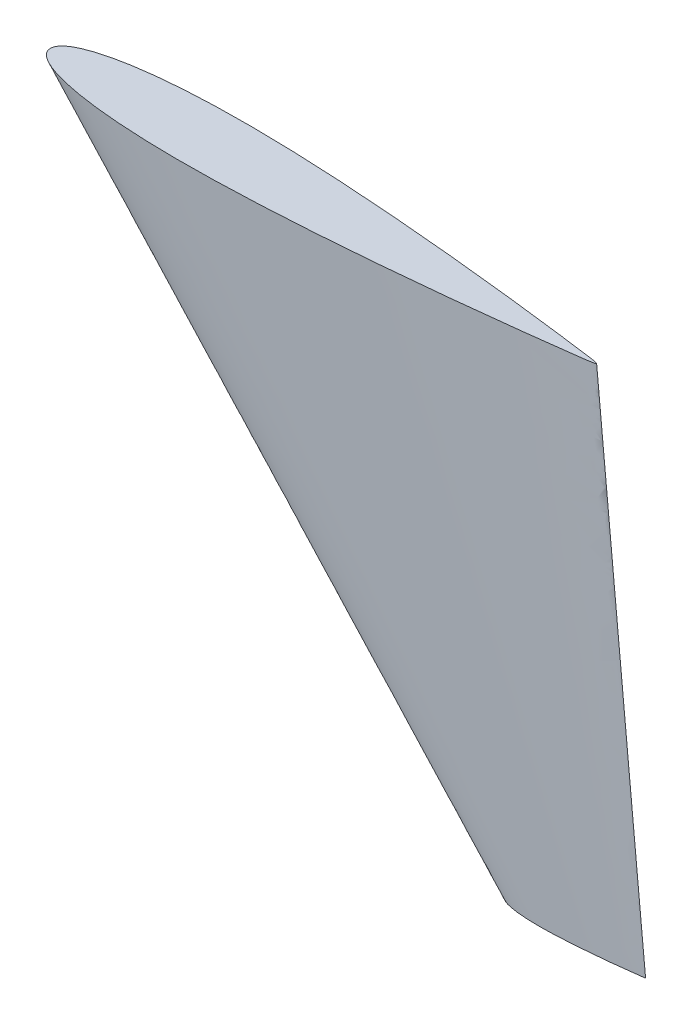
ISO-10303-21;
HEADER;
FILE_DESCRIPTION(('STEP AP214'),'2;1');
FILE_NAME('part.step','',(''),(''),'','','');
FILE_SCHEMA(('AUTOMOTIVE_DESIGN { 1 0 10303 214 1 1 1 1 }'));
ENDSEC;
DATA;
#1=APPLICATION_CONTEXT('core data for automotive mechanical design processes');
#2=APPLICATION_PROTOCOL_DEFINITION('international standard','automotive_design',2000,#1);
#3=PRODUCT_CONTEXT('',#1,'mechanical');
#4=PRODUCT('Part','Part','',(#3));
#5=PRODUCT_RELATED_PRODUCT_CATEGORY('part','',(#4));
#6=PRODUCT_DEFINITION_FORMATION('','',#4);
#7=PRODUCT_DEFINITION_CONTEXT('part definition',#1,'design');
#8=PRODUCT_DEFINITION('design','',#6,#7);
#9=PRODUCT_DEFINITION_SHAPE('','',#8);
#10=(LENGTH_UNIT() NAMED_UNIT(*) SI_UNIT(.MILLI.,.METRE.));
#11=(NAMED_UNIT(*) PLANE_ANGLE_UNIT() SI_UNIT($,.RADIAN.));
#12=(NAMED_UNIT(*) SI_UNIT($,.STERADIAN.) SOLID_ANGLE_UNIT());
#13=UNCERTAINTY_MEASURE_WITH_UNIT(LENGTH_MEASURE(1.E-05),#10,'distance_accuracy_value','');
#14=(GEOMETRIC_REPRESENTATION_CONTEXT(3) GLOBAL_UNCERTAINTY_ASSIGNED_CONTEXT((#13)) GLOBAL_UNIT_ASSIGNED_CONTEXT((#10,
#11,#12)) REPRESENTATION_CONTEXT('',''));
#15=CARTESIAN_POINT('',(0.,0.,0.));
#16=DIRECTION('',(0.,0.,1.));
#17=DIRECTION('',(1.,0.,0.));
#18=AXIS2_PLACEMENT_3D('',#15,#16,#17);
#19=CARTESIAN_POINT('',(0.,0.,-2.89213779437517E-12));
#20=DIRECTION('',(0.,-1.,0.));
#21=DIRECTION('',(0.,0.,-1.));
#22=AXIS2_PLACEMENT_3D('',#19,#20,#21);
#23=PLANE('',#22);
#24=CARTESIAN_POINT('',(7800.,0.,0.));
#25=CARTESIAN_POINT('',(7800.,0.,-6.53925924655097));
#26=CARTESIAN_POINT('',(7715.67329600913,0.,-24.3669523544777));
#27=CARTESIAN_POINT('',(7640.06647862999,0.,-30.8897909751289));
#28=CARTESIAN_POINT('',(7506.69214567683,0.,-50.5762287041684));
#29=CARTESIAN_POINT('',(7362.75356535692,0.,-69.0228106852286));
#30=CARTESIAN_POINT('',(7198.72313680974,0.,-90.5200279945573));
#31=CARTESIAN_POINT('',(7022.25196467298,0.,-112.692921099859));
#32=CARTESIAN_POINT('',(6834.27758249127,0.,-135.808011807423));
#33=CARTESIAN_POINT('',(6637.06943651528,0.,-159.394110654187));
#34=CARTESIAN_POINT('',(6432.07399162929,0.,-183.099280039837));
#35=CARTESIAN_POINT('',(6220.65040230479,0.,-206.882728292744));
#36=CARTESIAN_POINT('',(6003.93279029509,0.,-230.360435754586));
#37=CARTESIAN_POINT('',(5782.96571679836,0.,-253.604866134166));
#38=CARTESIAN_POINT('',(5558.69013182153,0.,-276.274064255674));
#39=CARTESIAN_POINT('',(5331.96829520196,0.,-298.245530819103));
#40=CARTESIAN_POINT('',(5103.60656338106,0.,-319.413756594173));
#41=CARTESIAN_POINT('',(4874.3511666855,0.,-339.839380895817));
#42=CARTESIAN_POINT('',(4644.83670892462,0.,-358.937100799179));
#43=CARTESIAN_POINT('',(4415.73297948451,0.,-377.096461196962));
#44=CARTESIAN_POINT('',(4187.62692680943,0.,-393.801210238087));
#45=CARTESIAN_POINT('',(3961.12393046965,0.,-409.332226476269));
#46=CARTESIAN_POINT('',(3736.73644679765,0.,-423.100620615322));
#47=CARTESIAN_POINT('',(3515.00574819094,0.,-435.28472535015));
#48=CARTESIAN_POINT('',(3296.42152697293,0.,-445.762492618663));
#49=CARTESIAN_POINT('',(3081.44991889856,0.,-454.397354141702));
#50=CARTESIAN_POINT('',(2870.55390258635,0.,-460.905755312769));
#51=CARTESIAN_POINT('',(2664.18654016437,0.,-465.616457962664));
#52=CARTESIAN_POINT('',(2462.75311754355,0.,-467.99250286914));
#53=CARTESIAN_POINT('',(2266.67474484628,0.,-468.430992739171));
#54=CARTESIAN_POINT('',(2076.3414608842,0.,-466.36091762238));
#55=CARTESIAN_POINT('',(1892.13829254239,0.,-462.260282902571));
#56=CARTESIAN_POINT('',(1714.43584887484,0.,-455.727917427635));
#57=CARTESIAN_POINT('',(1543.59300624981,0.,-446.976237187352));
#58=CARTESIAN_POINT('',(1379.99762905575,0.,-435.984639569769));
#59=CARTESIAN_POINT('',(1223.97029033573,0.,-422.688570015667));
#60=CARTESIAN_POINT('',(1075.82583002026,0.,-407.301819553241));
#61=CARTESIAN_POINT('',(935.912616229804,0.,-389.566943881137));
#62=CARTESIAN_POINT('',(804.536382757159,0.,-369.854970921905));
#63=CARTESIAN_POINT('',(682.013792436799,0.,-348.272555877616));
#64=CARTESIAN_POINT('',(568.693027246663,0.,-324.568119904927));
#65=CARTESIAN_POINT('',(464.786855228411,0.,-299.165291646043));
#66=CARTESIAN_POINT('',(370.596753034188,0.,-272.055292928938));
#67=CARTESIAN_POINT('',(286.404046182979,0.,-243.356904752415));
#68=CARTESIAN_POINT('',(212.506820599986,0.,-213.083136367971));
#69=CARTESIAN_POINT('',(149.052021217133,0.,-181.459345845315));
#70=CARTESIAN_POINT('',(96.2757843861637,0.,-148.410904473162));
#71=CARTESIAN_POINT('',(54.3577326462225,0.,-113.918531986578));
#72=CARTESIAN_POINT('',(23.5554280154315,0.,-77.7813546525763));
#73=CARTESIAN_POINT('',(4.41874234212622,0.,-39.661970030682));
#74=CARTESIAN_POINT('',(-2.1412179041184,0.,4.93934917453882E-13));
#75=CARTESIAN_POINT('',(4.41874234212666,0.,39.661970030684));
#76=CARTESIAN_POINT('',(23.5554280154311,0.,77.7813546525725));
#77=CARTESIAN_POINT('',(54.3577326462229,0.,113.91853198658));
#78=CARTESIAN_POINT('',(96.2757843861631,0.,148.410904473159));
#79=CARTESIAN_POINT('',(149.052021217134,0.,181.459345845317));
#80=CARTESIAN_POINT('',(212.506820599985,0.,213.083136367972));
#81=CARTESIAN_POINT('',(286.404046182979,0.,243.356904752415));
#82=CARTESIAN_POINT('',(370.596753034187,0.,272.055292928939));
#83=CARTESIAN_POINT('',(464.786855228411,0.,299.165291646041));
#84=CARTESIAN_POINT('',(568.693027246663,0.,324.568119904926));
#85=CARTESIAN_POINT('',(682.013792436799,0.,348.272555877616));
#86=CARTESIAN_POINT('',(804.536382757158,0.,369.854970921905));
#87=CARTESIAN_POINT('',(935.912616229805,0.,389.566943881137));
#88=CARTESIAN_POINT('',(1075.82583002026,0.,407.30181955324));
#89=CARTESIAN_POINT('',(1223.97029033572,0.,422.688570015665));
#90=CARTESIAN_POINT('',(1379.99762905575,0.,435.984639569768));
#91=CARTESIAN_POINT('',(1543.59300624981,0.,446.976237187353));
#92=CARTESIAN_POINT('',(1714.43584887483,0.,455.727917427633));
#93=CARTESIAN_POINT('',(1892.1382925424,0.,462.260282902571));
#94=CARTESIAN_POINT('',(2076.3414608842,0.,466.36091762238));
#95=CARTESIAN_POINT('',(2266.67474484627,0.,468.430992739172));
#96=CARTESIAN_POINT('',(2462.75311754355,0.,467.992502869139));
#97=CARTESIAN_POINT('',(2664.18654016436,0.,465.616457962664));
#98=CARTESIAN_POINT('',(2870.55390258635,0.,460.90575531277));
#99=CARTESIAN_POINT('',(3081.44991889855,0.,454.397354141699));
#100=CARTESIAN_POINT('',(3296.42152697293,0.,445.762492618662));
#101=CARTESIAN_POINT('',(3515.00574819094,0.,435.284725350148));
#102=CARTESIAN_POINT('',(3736.73644679765,0.,423.100620615321));
#103=CARTESIAN_POINT('',(3961.12393046965,0.,409.332226476268));
#104=CARTESIAN_POINT('',(4187.62692680943,0.,393.801210238087));
#105=CARTESIAN_POINT('',(4415.73297948451,0.,377.096461196962));
#106=CARTESIAN_POINT('',(4644.83670892462,0.,358.937100799178));
#107=CARTESIAN_POINT('',(4874.3511666855,0.,339.839380895817));
#108=CARTESIAN_POINT('',(5103.60656338106,0.,319.413756594172));
#109=CARTESIAN_POINT('',(5331.96829520197,0.,298.245530819101));
#110=CARTESIAN_POINT('',(5558.69013182153,0.,276.274064255672));
#111=CARTESIAN_POINT('',(5782.96571679836,0.,253.604866134166));
#112=CARTESIAN_POINT('',(6003.93279029508,0.,230.360435754585));
#113=CARTESIAN_POINT('',(6220.6504023048,0.,206.882728292743));
#114=CARTESIAN_POINT('',(6432.07399162929,0.,183.099280039837));
#115=CARTESIAN_POINT('',(6637.06943651528,0.,159.394110654187));
#116=CARTESIAN_POINT('',(6834.27758249126,0.,135.808011807422));
#117=CARTESIAN_POINT('',(7022.25196467298,0.,112.692921099855));
#118=CARTESIAN_POINT('',(7198.72313680974,0.,90.5200279945546));
#119=CARTESIAN_POINT('',(7362.75356535692,0.,69.0228106852282));
#120=CARTESIAN_POINT('',(7506.69214567683,0.,50.5762287041657));
#121=CARTESIAN_POINT('',(7640.06647862999,0.,30.8897909751275));
#122=CARTESIAN_POINT('',(7715.67329600913,0.,24.3669523544768));
#123=CARTESIAN_POINT('',(7800.,0.,6.53925924655098));
#124=CARTESIAN_POINT('',(7800.,0.,0.));
#125=B_SPLINE_CURVE_WITH_KNOTS('',3,(#24,#25,#26,#27,#28,#29,#30,#31,#32,#33,#34,#35,#36,#37,
#38,#39,#40,#41,#42,#43,#44,#45,#46,#47,#48,#49,#50,#51,#52,#53,#54,#55,#56,#57,#58,#59,#60,#61,
#62,#63,#64,#65,#66,#67,#68,#69,#70,#71,#72,#73,#74,#75,#76,#77,#78,#79,#80,#81,#82,#83,#84,#85,
#86,#87,#88,#89,#90,#91,#92,#93,#94,#95,#96,#97,#98,#99,#100,#101,#102,#103,#104,#105,#106,#107,
#108,#109,#110,#111,#112,#113,#114,#115,#116,#117,#118,#119,#120,#121,#122,#123,#124),
.UNSPECIFIED.,.T.,.F.,(4,1,1,1,1,1,1,1,1,1,1,1,1,1,1,1,1,1,1,1,1,1,1,1,1,1,1,1,1,1,1,1,1,1,1,1,
1,1,1,1,1,1,1,1,1,1,1,1,1,1,1,1,1,1,1,1,1,1,1,1,1,1,1,1,1,1,1,1,1,1,1,1,1,1,1,1,1,1,1,1,1,1,1,1,
1,1,1,1,1,1,1,1,1,1,1,1,1,1,4),(0.,0.00370123987506932,0.0100905264837692,0.0181897398349947,
0.0275712531032488,0.0379779032348915,0.0492199890854108,0.0611589846164829,0.0736758380002269,
0.0866758818301919,0.100070487809901,0.113794850526326,0.127780381717722,0.141967224326997,
0.156300965539977,0.170732574325841,0.185213017834877,0.199701805107877,0.214160602617209,
0.228549517539899,0.242829846374342,0.256971419856509,0.270940603732409,0.284703511960829,
0.298235956775089,0.311509100343719,0.324489816433092,0.337159349651097,0.349494602042227,
0.361462813894123,0.373050959586776,0.384236738836534,0.394992869371616,0.405307195090872,
0.415153289482299,0.424519405818651,0.433390491805171,0.441744901957357,0.449567589605019,
0.456846488766345,0.463571987722499,0.469733338138845,0.47532270467788,0.480336691423548,
0.484781058090828,0.488676263152727,0.492054747684636,0.494979990042027,0.497567422047131,0.5,
0.502432577952869,0.505020009957974,0.507945252315365,0.511323736847273,0.515218941909172,
0.519663308576452,0.524677295322121,0.530266661861155,0.536428012277502,0.543153511233656,
0.550432410394982,0.558255098042644,0.566609508194829,0.575480594181349,0.584846710517701,
0.594692804909128,0.605007130628384,0.615763261163466,0.626949040413224,0.638537186105877,
0.650505397957773,0.662840650348903,0.675510183566908,0.688490899656281,0.701764043224911,
0.715296488039171,0.729059396267592,0.743028580143492,0.757170153625658,0.771450482460101,
0.785839397382791,0.800298194892123,0.814786982165123,0.82926742567416,0.843699034460024,
0.858032775673003,0.872219618282278,0.886205149473674,0.899929512190099,0.913324118169808,
0.926324161999773,0.938841015383517,0.950780010914589,0.962022096765109,0.972428746896751,
0.981810260165005,0.989909473516231,0.996298760124931,1.),.UNSPECIFIED.);
#126=CARTESIAN_POINT('',(7800.,0.,0.));
#127=VERTEX_POINT('',#126);
#128=EDGE_CURVE('E11',#127,#127,#125,.T.);
#129=ORIENTED_EDGE('',*,*,#128,.T.);
#130=EDGE_LOOP('',(#129));
#131=FACE_BOUND('',#130,.T.);
#132=ADVANCED_FACE('F51',(#131),#23,.F.);
#133=CARTESIAN_POINT('',(6500.,-7250.,-6.37019547186018E-12));
#134=DIRECTION('',(0.,-1.,0.));
#135=DIRECTION('',(0.,0.,-1.));
#136=AXIS2_PLACEMENT_3D('',#133,#134,#135);
#137=PLANE('',#136);
#138=CARTESIAN_POINT('',(8500.,-7250.,0.));
#139=CARTESIAN_POINT('',(8500.,-7250.,-1.67673314014127));
#140=CARTESIAN_POINT('',(8478.37776820747,-7250.,-6.24793650114817));
#141=CARTESIAN_POINT('',(8458.99140477692,-7250.,-7.92045922439215));
#142=CARTESIAN_POINT('',(8424.79285786585,-7250.,-12.9682637702997));
#143=CARTESIAN_POINT('',(8387.8855295787,-7250.,-17.6981565859566));
#144=CARTESIAN_POINT('',(8345.82644533583,-7250.,-23.2102635883487));
#145=CARTESIAN_POINT('',(8300.57742683923,-7250.,-28.8956207948364));
#146=CARTESIAN_POINT('',(8252.37886730546,-7250.,-34.8225671301093));
#147=CARTESIAN_POINT('',(8201.81267602956,-7250.,-40.8702847831261));
#148=CARTESIAN_POINT('',(8149.24974144341,-7250.,-46.948533343549));
#149=CARTESIAN_POINT('',(8095.03856469354,-7250.,-53.0468534083973));
#150=CARTESIAN_POINT('',(8039.46994622951,-7250.,-59.0667783986132));
#151=CARTESIAN_POINT('',(7982.81172225599,-7250.,-65.0268887523517));
#152=CARTESIAN_POINT('',(7925.30516200552,-7250.,-70.8395036553026));
#153=CARTESIAN_POINT('',(7867.1713577441,-7250.,-76.4732130305411));
#154=CARTESIAN_POINT('',(7808.6170675336,-7250.,-81.9009632292776));
#155=CARTESIAN_POINT('',(7749.83363248346,-7250.,-87.1383027938011));
#156=CARTESIAN_POINT('',(7690.98377151914,-7250.,-92.0351540510742));
#157=CARTESIAN_POINT('',(7632.23922550886,-7250.,-96.691400306916));
#158=CARTESIAN_POINT('',(7573.7504940537,-7250.,-100.97466929182));
#159=CARTESIAN_POINT('',(7515.67280268453,-7250.,-104.956981147765));
#160=CARTESIAN_POINT('',(7458.13755046093,-7250.,-108.487338619317));
#161=CARTESIAN_POINT('',(7401.28352517716,-7250.,-111.611468038503));
#162=CARTESIAN_POINT('',(7345.23628896742,-7250.,-114.29807503043));
#163=CARTESIAN_POINT('',(7290.11536382014,-7250.,-116.512142087619));
#164=CARTESIAN_POINT('',(7236.03946220163,-7250.,-118.180962900714));
#165=CARTESIAN_POINT('',(7183.1247538883,-7250.,-119.388835375046));
#166=CARTESIAN_POINT('',(7131.4751583445,-7250.,-119.998077658758));
#167=CARTESIAN_POINT('',(7081.1986525247,-7250.,-120.110510958766));
#168=CARTESIAN_POINT('',(7032.39524638057,-7250.,-119.579722467281));
#169=CARTESIAN_POINT('',(6985.16366475446,-7250.,-118.52827766733));
#170=CARTESIAN_POINT('',(6939.59893560893,-7250.,-116.853312160937));
#171=CARTESIAN_POINT('',(6895.79307852559,-7250.,-114.609291586505));
#172=CARTESIAN_POINT('',(6853.84554591173,-7250.,-111.790933223023));
#173=CARTESIAN_POINT('',(6813.83853598352,-7250.,-108.381684619407));
#174=CARTESIAN_POINT('',(6775.85277692827,-7250.,-104.436363988016));
#175=CARTESIAN_POINT('',(6739.97759390508,-7250.,-99.8889599695276));
#176=CARTESIAN_POINT('',(6706.29138019414,-7250.,-94.8346079286989));
#177=CARTESIAN_POINT('',(6674.87533139405,-7250.,-89.3006553532399));
#178=CARTESIAN_POINT('',(6645.81872493504,-7250.,-83.2225948474223));
#179=CARTESIAN_POINT('',(6619.17611672523,-7250.,-76.7090491400159));
#180=CARTESIAN_POINT('',(6595.02480847031,-7250.,-69.7577674176821));
#181=CARTESIAN_POINT('',(6573.43693491871,-7250.,-62.3992063467786));
#182=CARTESIAN_POINT('',(6554.48892835897,-7250.,-54.6367016328187));
#183=CARTESIAN_POINT('',(6538.21846697875,-7250.,-46.5280373962402));
#184=CARTESIAN_POINT('',(6524.68609856056,-7250.,-38.0540780700472));
#185=CARTESIAN_POINT('',(6513.9378801657,-7250.,-29.209879996564));
#186=CARTESIAN_POINT('',(6506.03985333729,-7250.,-19.9439370904096));
#187=CARTESIAN_POINT('',(6501.13301085696,-7250.,-10.1697359053089));
#188=CARTESIAN_POINT('',(6499.45096976818,-7250.,-5.45203157884016E-12));
#189=CARTESIAN_POINT('',(6501.13301085695,-7250.,10.1697359052979));
#190=CARTESIAN_POINT('',(6506.03985333729,-7250.,19.9439370903977));
#191=CARTESIAN_POINT('',(6513.9378801657,-7250.,29.2098799965535));
#192=CARTESIAN_POINT('',(6524.68609856056,-7250.,38.0540780700355));
#193=CARTESIAN_POINT('',(6538.21846697875,-7250.,46.5280373962296));
#194=CARTESIAN_POINT('',(6554.48892835897,-7250.,54.6367016328081));
#195=CARTESIAN_POINT('',(6573.43693491871,-7250.,62.3992063467678));
#196=CARTESIAN_POINT('',(6595.02480847031,-7250.,69.7577674176715));
#197=CARTESIAN_POINT('',(6619.17611672523,-7250.,76.7090491400055));
#198=CARTESIAN_POINT('',(6645.81872493504,-7250.,83.2225948474117));
#199=CARTESIAN_POINT('',(6674.87533139405,-7250.,89.3006553532299));
#200=CARTESIAN_POINT('',(6706.29138019414,-7250.,94.8346079286887));
#201=CARTESIAN_POINT('',(6739.97759390508,-7250.,99.8889599695175));
#202=CARTESIAN_POINT('',(6775.85277692827,-7250.,104.436363988006));
#203=CARTESIAN_POINT('',(6813.83853598352,-7250.,108.381684619397));
#204=CARTESIAN_POINT('',(6853.84554591173,-7250.,111.790933223013));
#205=CARTESIAN_POINT('',(6895.79307852559,-7250.,114.609291586496));
#206=CARTESIAN_POINT('',(6939.59893560893,-7250.,116.853312160928));
#207=CARTESIAN_POINT('',(6985.16366475446,-7250.,118.528277667322));
#208=CARTESIAN_POINT('',(7032.39524638057,-7250.,119.579722467273));
#209=CARTESIAN_POINT('',(7081.19865252469,-7250.,120.110510958758));
#210=CARTESIAN_POINT('',(7131.4751583445,-7250.,119.99807765875));
#211=CARTESIAN_POINT('',(7183.1247538883,-7250.,119.388835375039));
#212=CARTESIAN_POINT('',(7236.03946220163,-7250.,118.180962900707));
#213=CARTESIAN_POINT('',(7290.11536382014,-7250.,116.512142087612));
#214=CARTESIAN_POINT('',(7345.23628896742,-7250.,114.298075030423));
#215=CARTESIAN_POINT('',(7401.28352517717,-7250.,111.611468038497));
#216=CARTESIAN_POINT('',(7458.13755046094,-7250.,108.48733861931));
#217=CARTESIAN_POINT('',(7515.67280268453,-7250.,104.956981147758));
#218=CARTESIAN_POINT('',(7573.7504940537,-7250.,100.974669291815));
#219=CARTESIAN_POINT('',(7632.23922550885,-7250.,96.6914003069109));
#220=CARTESIAN_POINT('',(7690.98377151914,-7250.,92.0351540510691));
#221=CARTESIAN_POINT('',(7749.83363248346,-7250.,87.1383027937972));
#222=CARTESIAN_POINT('',(7808.61706753361,-7250.,81.9009632292731));
#223=CARTESIAN_POINT('',(7867.17135774409,-7250.,76.4732130305372));
#224=CARTESIAN_POINT('',(7925.30516200551,-7250.,70.8395036552992));
#225=CARTESIAN_POINT('',(7982.81172225599,-7250.,65.0268887523488));
#226=CARTESIAN_POINT('',(8039.46994622951,-7250.,59.0667783986104));
#227=CARTESIAN_POINT('',(8095.03856469354,-7250.,53.0468534083944));
#228=CARTESIAN_POINT('',(8149.24974144342,-7250.,46.9485333435471));
#229=CARTESIAN_POINT('',(8201.81267602956,-7250.,40.870284783124));
#230=CARTESIAN_POINT('',(8252.37886730546,-7250.,34.8225671301077));
#231=CARTESIAN_POINT('',(8300.57742683923,-7250.,28.8956207948341));
#232=CARTESIAN_POINT('',(8345.82644533583,-7250.,23.2102635883469));
#233=CARTESIAN_POINT('',(8387.8855295787,-7250.,17.6981565859555));
#234=CARTESIAN_POINT('',(8424.79285786586,-7250.,12.9682637702986));
#235=CARTESIAN_POINT('',(8458.99140477692,-7250.,7.9204592243915));
#236=CARTESIAN_POINT('',(8478.37776820747,-7250.,6.24793650114773));
#237=CARTESIAN_POINT('',(8500.,-7250.,1.67673314014125));
#238=CARTESIAN_POINT('',(8500.,-7250.,0.));
#239=B_SPLINE_CURVE_WITH_KNOTS('',3,(#138,#139,#140,#141,#142,#143,#144,#145,#146,#147,#148,
#149,#150,#151,#152,#153,#154,#155,#156,#157,#158,#159,#160,#161,#162,#163,#164,#165,#166,#167,
#168,#169,#170,#171,#172,#173,#174,#175,#176,#177,#178,#179,#180,#181,#182,#183,#184,#185,#186,
#187,#188,#189,#190,#191,#192,#193,#194,#195,#196,#197,#198,#199,#200,#201,#202,#203,#204,#205,
#206,#207,#208,#209,#210,#211,#212,#213,#214,#215,#216,#217,#218,#219,#220,#221,#222,#223,#224,
#225,#226,#227,#228,#229,#230,#231,#232,#233,#234,#235,#236,#237,#238),.UNSPECIFIED.,.T.,.F.,(4,
1,1,1,1,1,1,1,1,1,1,1,1,1,1,1,1,1,1,1,1,1,1,1,1,1,1,1,1,1,1,1,1,1,1,1,1,1,1,1,1,1,1,1,1,1,1,1,1,
1,1,1,1,1,1,1,1,1,1,1,1,1,1,1,1,1,1,1,1,1,1,1,1,1,1,1,1,1,1,1,1,1,1,1,1,1,1,1,1,1,1,1,1,1,1,1,1,
1,4),(0.,0.00370123987506932,0.0100905264837692,0.0181897398349947,0.0275712531032488,
0.0379779032348915,0.0492199890854108,0.0611589846164829,0.0736758380002269,0.0866758818301919,
0.100070487809901,0.113794850526326,0.127780381717722,0.141967224326997,0.156300965539977,
0.170732574325841,0.185213017834877,0.199701805107877,0.214160602617209,0.228549517539899,
0.242829846374342,0.256971419856509,0.270940603732409,0.284703511960829,0.298235956775089,
0.311509100343719,0.324489816433092,0.337159349651097,0.349494602042227,0.361462813894123,
0.373050959586776,0.384236738836534,0.394992869371616,0.405307195090872,0.415153289482299,
0.424519405818651,0.433390491805171,0.441744901957357,0.449567589605019,0.456846488766345,
0.463571987722499,0.469733338138845,0.47532270467788,0.480336691423548,0.484781058090828,
0.488676263152727,0.492054747684636,0.494979990042027,0.497567422047131,0.5,0.502432577952869,
0.505020009957974,0.507945252315365,0.511323736847273,0.515218941909172,0.519663308576452,
0.524677295322121,0.530266661861155,0.536428012277502,0.543153511233656,0.550432410394982,
0.558255098042644,0.566609508194829,0.575480594181349,0.584846710517701,0.594692804909128,
0.605007130628384,0.615763261163466,0.626949040413224,0.638537186105877,0.650505397957773,
0.662840650348903,0.675510183566908,0.688490899656281,0.701764043224911,0.715296488039171,
0.729059396267592,0.743028580143492,0.757170153625658,0.771450482460101,0.785839397382791,
0.800298194892123,0.814786982165123,0.82926742567416,0.843699034460024,0.858032775673003,
0.872219618282278,0.886205149473674,0.899929512190099,0.913324118169808,0.926324161999773,
0.938841015383517,0.950780010914589,0.962022096765109,0.972428746896751,0.981810260165005,
0.989909473516231,0.996298760124931,1.),.UNSPECIFIED.);
#240=CARTESIAN_POINT('',(8500.,-7250.,0.));
#241=VERTEX_POINT('',#240);
#242=EDGE_CURVE('E61',#241,#241,#239,.T.);
#243=ORIENTED_EDGE('',*,*,#242,.F.);
#244=EDGE_LOOP('',(#243));
#245=FACE_BOUND('',#244,.T.);
#246=ADVANCED_FACE('F89',(#245),#137,.T.);
#247=CARTESIAN_POINT('',(8499.98281682195,-7250.,-0.135896126838395));
#248=CARTESIAN_POINT('',(7799.73483246372,0.,-1.05976353847695));
#249=CARTESIAN_POINT('',(8499.58389608387,-7250.,-1.72168691020939));
#250=CARTESIAN_POINT('',(7796.67384421276,0.,-7.24038719585081));
#251=CARTESIAN_POINT('',(8492.10732967935,-7250.,-3.34057991854656));
#252=CARTESIAN_POINT('',(7766.87804303047,0.,-13.5024552749464));
#253=CARTESIAN_POINT('',(8474.71546216689,-7250.,-6.54665021866417));
#254=CARTESIAN_POINT('',(7699.8731992841,0.,-25.7300765369341));
#255=CARTESIAN_POINT('',(8467.73000858591,-7250.,-7.16655230975447));
#256=CARTESIAN_POINT('',(7672.83597263253,0.,-28.0780118035752));
#257=CARTESIAN_POINT('',(8450.10325523188,-7250.,-9.23607487895835));
#258=CARTESIAN_POINT('',(7603.80741735264,0.,-36.2417334077155));
#259=CARTESIAN_POINT('',(8438.37701356273,-7250.,-10.9632030565414));
#260=CARTESIAN_POINT('',(7558.01408101805,0.,-42.9962544698161));
#261=CARTESIAN_POINT('',(8414.3446324778,-7250.,-14.3057545541282));
#262=CARTESIAN_POINT('',(7464.37252775195,0.,-55.9997385076094));
#263=CARTESIAN_POINT('',(8401.79047262674,-7250.,-15.9161557401267));
#264=CARTESIAN_POINT('',(7415.42843998922,0.,-62.272947992975));
#265=CARTESIAN_POINT('',(8375.43900598053,-7250.,-19.3295554373245));
#266=CARTESIAN_POINT('',(7312.63290175642,0.,-75.5914382664072));
#267=CARTESIAN_POINT('',(8361.19975865622,-7250.,-21.1954943766857));
#268=CARTESIAN_POINT('',(7257.09477335135,0.,-82.8686790392908));
#269=CARTESIAN_POINT('',(8332.07659108563,-7250.,-24.9374932813113));
#270=CARTESIAN_POINT('',(7143.52081203702,0.,-97.4559781077067));
#271=CARTESIAN_POINT('',(8316.79622777552,-7250.,-26.8577936806268));
#272=CARTESIAN_POINT('',(7083.92850703639,0.,-104.942821977616));
#273=CARTESIAN_POINT('',(8285.66849226321,-7250.,-30.7287757648598));
#274=CARTESIAN_POINT('',(6962.52801722923,0.,-120.037137085852));
#275=CARTESIAN_POINT('',(8269.413862825,-7250.,-32.7277845216131));
#276=CARTESIAN_POINT('',(6899.13438739277,0.,-127.831738303247));
#277=CARTESIAN_POINT('',(8236.53100079841,-7250.,-36.7177376376779));
#278=CARTESIAN_POINT('',(6770.89134835143,0.,-143.389006885224));
#279=CARTESIAN_POINT('',(8219.49799263311,-7250.,-38.7551205058948));
#280=CARTESIAN_POINT('',(6704.46249152637,0.,-151.332867524226));
#281=CARTESIAN_POINT('',(8185.17462480247,-7250.,-42.7939934994921));
#282=CARTESIAN_POINT('',(6570.60072522133,0.,-167.080389053911));
#283=CARTESIAN_POINT('',(8167.4786977414,-7250.,-44.8405816424384));
#284=CARTESIAN_POINT('',(6501.58636437748,0.,-175.06021736649));
#285=CARTESIAN_POINT('',(8131.95354521751,-7250.,-48.8939986457817));
#286=CARTESIAN_POINT('',(6363.03793835327,0.,-190.865279122159));
#287=CARTESIAN_POINT('',(8113.71885922985,-7250.,-50.945470966292));
#288=CARTESIAN_POINT('',(6291.92245624222,0.,-198.864106097034));
#289=CARTESIAN_POINT('',(8077.2009230073,-7250.,-54.9789753392506));
#290=CARTESIAN_POINT('',(6149.50201732961,0.,-214.590458888978));
#291=CARTESIAN_POINT('',(8058.51198568003,-7250.,-57.0038937647787));
#292=CARTESIAN_POINT('',(6076.61495066117,0.,-222.485720433603));
#293=CARTESIAN_POINT('',(8021.18051891342,-7250.,-60.9905023595006));
#294=CARTESIAN_POINT('',(5931.02188539868,0.,-238.030232100066));
#295=CARTESIAN_POINT('',(8002.13225162255,-7250.,-62.9944832330551));
#296=CARTESIAN_POINT('',(5856.73344372588,0.,-245.84385118327));
#297=CARTESIAN_POINT('',(7964.16123607975,-7250.,-66.9117495087614));
#298=CARTESIAN_POINT('',(5708.64603959672,0.,-261.116907567408));
#299=CARTESIAN_POINT('',(7944.83258313647,-7250.,-68.8657222538844));
#300=CARTESIAN_POINT('',(5633.26407225732,0.,-268.735220450536));
#301=CARTESIAN_POINT('',(7906.37459005562,-7250.,-72.6737677617608));
#302=CARTESIAN_POINT('',(5483.27746954687,0.,-283.582256586557));
#303=CARTESIAN_POINT('',(7886.8392175033,-7250.,-74.5672134606862));
#304=CARTESIAN_POINT('',(5407.08930290111,0.,-290.964486160642));
#305=CARTESIAN_POINT('',(7848.03441318816,-7250.,-78.246843723619));
#306=CARTESIAN_POINT('',(5255.75015068608,0.,-305.310650173403));
#307=CARTESIAN_POINT('',(7828.35881467659,-7250.,-80.0709816584392));
#308=CARTESIAN_POINT('',(5179.01512442178,0.,-312.422726491308));
#309=CARTESIAN_POINT('',(7789.34131553367,-7250.,-83.6181001489028));
#310=CARTESIAN_POINT('',(5026.84653363901,0.,-326.252729859331));
#311=CARTESIAN_POINT('',(7769.59313569733,-7250.,-85.3778199661298));
#312=CARTESIAN_POINT('',(4949.82841141245,0.,-333.113132282636));
#313=CARTESIAN_POINT('',(7730.4819916388,-7250.,-88.748136315016));
#314=CARTESIAN_POINT('',(4797.29441976918,0.,-346.251213002731));
#315=CARTESIAN_POINT('',(7710.71257899082,-7250.,-90.3935352929468));
#316=CARTESIAN_POINT('',(4720.1934916861,0.,-352.665669889926));
#317=CARTESIAN_POINT('',(7671.61466536565,-7250.,-93.5701310538209));
#318=CARTESIAN_POINT('',(4567.71129283801,0.,-365.050262858865));
#319=CARTESIAN_POINT('',(7651.87959182622,-7250.,-95.1346535390958));
#320=CARTESIAN_POINT('',(4490.74429919558,0.,-371.149258314163));
#321=CARTESIAN_POINT('',(7612.90191506448,-7250.,-98.1071070100814));
#322=CARTESIAN_POINT('',(4338.73087752794,0.,-382.73550835831));
#323=CARTESIAN_POINT('',(7593.25258982574,-7250.,-99.5464844110273));
#324=CARTESIAN_POINT('',(4262.09829930907,0.,-388.346247410701));
#325=CARTESIAN_POINT('',(7554.50161172147,-7250.,-102.294222905435));
#326=CARTESIAN_POINT('',(4110.96913668595,0.,-399.057535330604));
#327=CARTESIAN_POINT('',(7534.9930998069,-7250.,-103.632213470591));
#328=CARTESIAN_POINT('',(4034.88572707562,0.,-404.272545251539));
#329=CARTESIAN_POINT('',(7496.56226092688,-7250.,-106.129112097362));
#330=CARTESIAN_POINT('',(3885.00496087936,0.,-414.00287903508));
#331=CARTESIAN_POINT('',(7477.23293383969,-7250.,-107.315647755403));
#332=CARTESIAN_POINT('',(3809.62036160853,0.,-418.626751128832));
#333=CARTESIAN_POINT('',(7439.20833531722,-7250.,-109.527063816459));
#334=CARTESIAN_POINT('',(3661.32403681418,0.,-427.244533511994));
#335=CARTESIAN_POINT('',(7420.10590730436,-7250.,-110.577177898988));
#336=CARTESIAN_POINT('',(3586.82437235489,0.,-431.33640575134));
#337=CARTESIAN_POINT('',(7382.58161376143,-7250.,-112.507462252323));
#338=CARTESIAN_POINT('',(3440.479246027,0.,-438.857130259611));
#339=CARTESIAN_POINT('',(7363.75245106422,-7250.,-113.410508507671));
#340=CARTESIAN_POINT('',(3367.04532264755,0.,-442.375072365));
#341=CARTESIAN_POINT('',(7326.80817195539,-7250.,-115.037758615628));
#342=CARTESIAN_POINT('',(3222.96226861574,0.,-448.713163775572));
#343=CARTESIAN_POINT('',(7308.28562170543,-7250.,-115.782289145257));
#344=CARTESIAN_POINT('',(3150.72414254007,0.,-451.612276276737));
#345=CARTESIAN_POINT('',(7271.99443327361,-7250.,-117.070736041654));
#346=CARTESIAN_POINT('',(3009.18816095561,0.,-456.627403424961));
#347=CARTESIAN_POINT('',(7253.81823119137,-7250.,-117.632297435447));
#348=CARTESIAN_POINT('',(2938.30082661687,0.,-458.812867322349));
#349=CARTESIAN_POINT('',(7218.26706087976,-7250.,-118.586105571699));
#350=CARTESIAN_POINT('',(2799.65103002201,0.,-462.524239678485));
#351=CARTESIAN_POINT('',(7200.48439485033,-7250.,-118.992570647323));
#352=CARTESIAN_POINT('',(2730.29852250484,0.,-464.104351069412));
#353=CARTESIAN_POINT('',(7165.74656271036,-7250.,-119.593076453165));
#354=CARTESIAN_POINT('',(2594.82077444528,0.,-466.434674583204));
#355=CARTESIAN_POINT('',(7148.3836030825,-7250.,-119.79863099557));
#356=CARTESIAN_POINT('',(2527.10516167988,0.,-467.230837552799));
#357=CARTESIAN_POINT('',(7114.51887177385,-7250.,-120.035350572028));
#358=CARTESIAN_POINT('',(2395.03263327732,0.,-468.143946120814));
#359=CARTESIAN_POINT('',(7097.60921063208,-7250.,-120.073812043977));
#360=CARTESIAN_POINT('',(2329.08495029076,0.,-468.287866998801));
#361=CARTESIAN_POINT('',(7064.69781784894,-7250.,-119.930161593701));
#362=CARTESIAN_POINT('',(2200.73057493841,0.,-467.71378037157));
#363=CARTESIAN_POINT('',(7048.28813394314,-7250.,-119.75257437417));
#364=CARTESIAN_POINT('',(2136.73287260306,0.,-467.014645285281));
#365=CARTESIAN_POINT('',(7016.39649466585,-7250.,-119.222798467018));
#366=CARTESIAN_POINT('',(2012.35567693874,0.,-464.936499521525));
#367=CARTESIAN_POINT('',(7000.50656685767,-7250.,-118.869833339979));
#368=CARTESIAN_POINT('',(1950.3851213584,0.,-463.552999766364));
#369=CARTESIAN_POINT('',(6969.68809147201,-7250.,-117.958416752921));
#370=CARTESIAN_POINT('',(1830.19350833745,0.,-459.983184392604));
#371=CARTESIAN_POINT('',(6954.35156993068,-7250.,-117.395620961642));
#372=CARTESIAN_POINT('',(1770.38135726915,0.,-457.780540822686));
#373=CARTESIAN_POINT('',(6924.67964665271,-7250.,-116.088076615565));
#374=CARTESIAN_POINT('',(1654.66152686967,0.,-452.665888344466));
#375=CARTESIAN_POINT('',(6909.93634282166,-7250.,-115.333801462196));
#376=CARTESIAN_POINT('',(1597.16306170813,0.,-449.716091854941));
#377=CARTESIAN_POINT('',(6881.47059766723,-7250.,-113.645925621355));
#378=CARTESIAN_POINT('',(1486.14763371917,0.,-443.116614558163));
#379=CARTESIAN_POINT('',(6867.34039284679,-7250.,-112.697620991132));
#380=CARTESIAN_POINT('',(1431.04045001899,0.,-439.409168149912));
#381=CARTESIAN_POINT('',(6840.14122136003,-7250.,-110.621894865036));
#382=CARTESIAN_POINT('',(1324.96511520393,0.,-431.294973400278));
#383=CARTESIAN_POINT('',(6826.66465972464,-7250.,-109.474679185426));
#384=CARTESIAN_POINT('',(1272.40735288622,0.,-426.81110400027));
#385=CARTESIAN_POINT('',(6800.7912437562,-7250.,-107.025306865671));
#386=CARTESIAN_POINT('',(1171.50284677453,0.,-417.239135998638));
#387=CARTESIAN_POINT('',(6787.98716108152,-7250.,-105.696679362507));
#388=CARTESIAN_POINT('',(1121.56808138444,0.,-412.046501723245));
#389=CARTESIAN_POINT('',(6763.48679004213,-7250.,-102.867374516224));
#390=CARTESIAN_POINT('',(1026.01934462911,0.,-400.988535752904));
#391=CARTESIAN_POINT('',(6751.38357809379,-7250.,-101.334739864254));
#392=CARTESIAN_POINT('',(978.818353572315,0.,-394.999153942507));
#393=CARTESIAN_POINT('',(6728.31643630431,-7250.,-98.1377528815753));
#394=CARTESIAN_POINT('',(888.859804070591,0.,-382.507038627183));
#395=CARTESIAN_POINT('',(6716.94625846507,-7250.,-96.4332888073388));
#396=CARTESIAN_POINT('',(844.518046008561,0.,-375.846778480335));
#397=CARTESIAN_POINT('',(6695.36994995309,-7250.,-92.9090729768173));
#398=CARTESIAN_POINT('',(760.374702791823,0.,-362.075869096087));
#399=CARTESIAN_POINT('',(6684.75834154373,-7250.,-91.0415524921242));
#400=CARTESIAN_POINT('',(718.992145771404,0.,-354.7773148219));
#401=CARTESIAN_POINT('',(6664.7282713181,-7250.,-87.1759319118616));
#402=CARTESIAN_POINT('',(640.881181520378,0.,-339.668436939468));
#403=CARTESIAN_POINT('',(6654.90495106217,-7250.,-85.1232514932053));
#404=CARTESIAN_POINT('',(602.573846730225,0.,-331.645726011132));
#405=CARTESIAN_POINT('',(6636.46670547866,-7250.,-80.9339366591896));
#406=CARTESIAN_POINT('',(530.672461636174,0.,-315.27290789058));
#407=CARTESIAN_POINT('',(6627.44849529021,-7250.,-78.7314680964357));
#408=CARTESIAN_POINT('',(495.50624661603,0.,-306.663820100203));
#409=CARTESIAN_POINT('',(6610.64694886053,-7250.,-74.2513832856395));
#410=CARTESIAN_POINT('',(429.991069826777,0.,-289.15029351329));
#411=CARTESIAN_POINT('',(6602.46170169762,-7250.,-71.8982700942358));
#412=CARTESIAN_POINT('',(398.075307145825,0.,-279.950035474933));
#413=CARTESIAN_POINT('',(6587.34933225778,-7250.,-67.1381054155662));
#414=CARTESIAN_POINT('',(339.152114988963,0.,-261.336901010658));
#415=CARTESIAN_POINT('',(6580.02220484692,-7250.,-64.6438975999173));
#416=CARTESIAN_POINT('',(310.585957025201,0.,-251.581552687736));
#417=CARTESIAN_POINT('',(6566.65204879179,-7250.,-59.6153418523416));
#418=CARTESIAN_POINT('',(258.464371358215,0.,-231.910747772792));
#419=CARTESIAN_POINT('',(6560.2111699765,-7250.,-56.9809549657726));
#420=CARTESIAN_POINT('',(233.358899913939,0.,-221.602902308305));
#421=CARTESIAN_POINT('',(6548.6253500602,-7250.,-51.7091206671193));
#422=CARTESIAN_POINT('',(188.205657476148,0.,-200.972233811201));
#423=CARTESIAN_POINT('',(6543.08637014732,-7250.,-48.9540406550084));
#424=CARTESIAN_POINT('',(166.624790416219,0.,-190.18566485046));
#425=CARTESIAN_POINT('',(6533.31999016066,-7250.,-43.4531530478308));
#426=CARTESIAN_POINT('',(128.58492616663,0.,-168.642865712387));
#427=CARTESIAN_POINT('',(6528.70315848319,-7250.,-40.5695580912314));
#428=CARTESIAN_POINT('',(110.612796409241,0.,-157.344336284921));
#429=CARTESIAN_POINT('',(6520.7967087284,-7250.,-34.8428234149547));
#430=CARTESIAN_POINT('',(79.8553186788065,0.,-134.899283678017));
#431=CARTESIAN_POINT('',(6517.12605375822,-7250.,-31.8332765176446));
#432=CARTESIAN_POINT('',(65.5942256147489,0.,-123.097532943058));
#433=CARTESIAN_POINT('',(6511.12237389478,-7250.,-25.8890169045346));
#434=CARTESIAN_POINT('',(42.3069593584022,0.,-99.7805985905656));
#435=CARTESIAN_POINT('',(6508.42710232267,-7250.,-22.744650899291));
#436=CARTESIAN_POINT('',(31.8843271820805,0.,-87.4445748088799));
#437=CARTESIAN_POINT('',(6504.36999109782,-7250.,-16.582193437732));
#438=CARTESIAN_POINT('',(16.2689241113225,0.,-63.2669789863071));
#439=CARTESIAN_POINT('',(6502.69708466786,-7250.,-13.2852979306672));
#440=CARTESIAN_POINT('',(9.87787854058115,0.,-50.3452750591164));
#441=CARTESIAN_POINT('',(6500.61394036785,-7250.,-6.90508688702738));
#442=CARTESIAN_POINT('',(2.05319532584628,0.,-25.3597103608043));
#443=CARTESIAN_POINT('',(6500.02256989186,-7250.,-3.45593359172167));
#444=CARTESIAN_POINT('',(-0.0844040888736562,0.,-11.8815693531113));
#445=CARTESIAN_POINT('',(6499.97835792593,-7250.,3.04655624438224));
#446=CARTESIAN_POINT('',(0.0880225782719753,0.,13.4781410076938));
#447=CARTESIAN_POINT('',(6500.52646033996,-7250.,6.50248983609844));
#448=CARTESIAN_POINT('',(2.3943674346227,0.,26.9298388593861));
#449=CARTESIAN_POINT('',(6502.53278936938,-7250.,12.9090448869474));
#450=CARTESIAN_POINT('',(10.5186302046612,0.,51.8126619295802));
#451=CARTESIAN_POINT('',(6504.1715190029,-7250.,16.2223023041753));
#452=CARTESIAN_POINT('',(17.0429652814933,0.,64.6705544071312));
#453=CARTESIAN_POINT('',(6508.17546850823,-7250.,22.4216858484247));
#454=CARTESIAN_POINT('',(32.8656990583846,0.,88.7041385072117));
#455=CARTESIAN_POINT('',(6510.84793829703,-7250.,25.5847688693702));
#456=CARTESIAN_POINT('',(43.3772581896383,0.,100.967165927663));
#457=CARTESIAN_POINT('',(6516.81903220891,-7250.,31.5634699853942));
#458=CARTESIAN_POINT('',(66.7916096570445,0.,124.149778418793));
#459=CARTESIAN_POINT('',(6520.47572273816,-7250.,34.5895599174347));
#460=CARTESIAN_POINT('',(81.1071640407481,0.,135.887011318301));
#461=CARTESIAN_POINT('',(6528.36225548955,-7250.,40.3447016115125));
#462=CARTESIAN_POINT('',(111.942318084436,0.,158.221276555779));
#463=CARTESIAN_POINT('',(6532.97049388888,-7250.,43.2417604390681));
#464=CARTESIAN_POINT('',(129.947961626572,0.,169.467296886518));
#465=CARTESIAN_POINT('',(6542.72430523493,-7250.,48.7655550898565));
#466=CARTESIAN_POINT('',(168.036843574538,0.,190.920758554512));
#467=CARTESIAN_POINT('',(6548.25786089132,-7250.,51.531342002867));
#468=CARTESIAN_POINT('',(189.638865234796,0.,201.665570601745));
#469=CARTESIAN_POINT('',(6559.83561536255,-7250.,56.8212570021244));
#470=CARTESIAN_POINT('',(234.823562908359,0.,222.225724366492));
#471=CARTESIAN_POINT('',(6566.27291573287,-7250.,59.4642943007106));
#472=CARTESIAN_POINT('',(259.942990287971,0.,232.499833224111));
#473=CARTESIAN_POINT('',(6579.63742487826,-7250.,64.5080904327476));
#474=CARTESIAN_POINT('',(312.086598903001,0.,252.111200639656));
#475=CARTESIAN_POINT('',(6586.9620807664,-7250.,67.0094617975996));
#476=CARTESIAN_POINT('',(340.662395805355,0.,261.838611120687));
#477=CARTESIAN_POINT('',(6602.07059157585,-7250.,71.782060378183));
#478=CARTESIAN_POINT('',(399.600636620698,0.,280.403253367499));
#479=CARTESIAN_POINT('',(6610.2541204684,-7250.,74.1411009008383));
#480=CARTESIAN_POINT('',(431.523100556076,0.,289.580394813974));
#481=CARTESIAN_POINT('',(6627.0528837477,-7250.,78.6317487436363));
#482=CARTESIAN_POINT('',(497.049131631842,0.,307.052725576078));
#483=CARTESIAN_POINT('',(6636.06986195799,-7250.,80.8392071514252));
#484=CARTESIAN_POINT('',(532.220151366766,0.,315.642352970818));
#485=CARTESIAN_POINT('',(6654.50611454621,-7250.,85.0373656438747));
#486=CARTESIAN_POINT('',(604.129309142458,0.,331.98068082348));
#487=CARTESIAN_POINT('',(6664.32850808214,-7250.,87.0944710101149));
#488=CARTESIAN_POINT('',(642.440258140614,0.,339.98613445624));
#489=CARTESIAN_POINT('',(6684.3569604542,-7250.,90.9685422620207));
#490=CARTESIAN_POINT('',(720.557532020565,0.,355.062054719264));
#491=CARTESIAN_POINT('',(6694.96787251072,-7250.,92.8399664348894));
#492=CARTESIAN_POINT('',(761.942804817041,0.,362.345384609567));
#493=CARTESIAN_POINT('',(6716.54308872014,-7250.,96.3709688411069));
#494=CARTESIAN_POINT('',(846.090408013779,0.,376.0898263486));
#495=CARTESIAN_POINT('',(6727.91277027451,-7250.,98.078727853119));
#496=CARTESIAN_POINT('',(890.434101586812,0.,382.737236238123));
#497=CARTESIAN_POINT('',(6750.97906501854,-7250.,101.281834344228));
#498=CARTESIAN_POINT('',(980.395954565794,0.,395.205485470571));
#499=CARTESIAN_POINT('',(6763.08188323823,-7250.,102.81757326997));
#500=CARTESIAN_POINT('',(1027.5984811643,0.,401.182760613251));
#501=CARTESIAN_POINT('',(6787.58155932934,-7250.,105.652949159801));
#502=CARTESIAN_POINT('',(1123.14992821793,0.,412.217049513755));
#503=CARTESIAN_POINT('',(6800.3853453268,-7250.,106.9843938458));
#504=CARTESIAN_POINT('',(1173.08585064918,0.,417.398696776095));
#505=CARTESIAN_POINT('',(6826.25829561185,-7250.,109.438744615449));
#506=CARTESIAN_POINT('',(1273.9921729261,0.,426.951248823141));
#507=CARTESIAN_POINT('',(6839.73464492408,-7250.,110.588454718015));
#508=CARTESIAN_POINT('',(1326.55076330413,0.,431.425389973621));
#509=CARTESIAN_POINT('',(6866.93344872282,-7250.,112.669017474332));
#510=CARTESIAN_POINT('',(1432.6275321025,0.,439.520721865396));
#511=CARTESIAN_POINT('',(6881.06349582543,-7250.,113.619644758499));
#512=CARTESIAN_POINT('',(1487.73533090222,0.,443.219109923267));
#513=CARTESIAN_POINT('',(6909.52899018157,-7250.,115.31181842434));
#514=CARTESIAN_POINT('',(1598.75173700449,0.,449.801825702548));
#515=CARTESIAN_POINT('',(6924.27218637684,-7250.,116.068176498577));
#516=CARTESIAN_POINT('',(1656.25062194558,0.,452.743498800685));
#517=CARTESIAN_POINT('',(6953.94393776132,-7250.,117.379625851967));
#518=CARTESIAN_POINT('',(1771.97112272964,0.,457.842921750384));
#519=CARTESIAN_POINT('',(6969.28038675319,-7250.,117.94440625451));
#520=CARTESIAN_POINT('',(1831.78355674084,0.,460.037825336374));
#521=CARTESIAN_POINT('',(7000.09874906626,-7250.,118.859743529833));
#522=CARTESIAN_POINT('',(1951.97561074491,0.,463.592350025902));
#523=CARTESIAN_POINT('',(7015.9886351125,-7250.,119.214487056797));
#524=CARTESIAN_POINT('',(2013.94632919681,0.,464.968914021352));
#525=CARTESIAN_POINT('',(7047.88022374437,-7250.,119.74734494494));
#526=CARTESIAN_POINT('',(2138.3237223782,0.,467.035040059246));
#527=CARTESIAN_POINT('',(7064.28989100985,-7250.,119.926610351681));
#528=CARTESIAN_POINT('',(2202.32148961082,0.,467.727630215419));
#529=CARTESIAN_POINT('',(7097.20126930532,-7250.,120.073812050971));
#530=CARTESIAN_POINT('',(2330.6759214651,0.,468.287866971493));
#531=CARTESIAN_POINT('',(7114.11093160957,-7250.,120.036909261744));
#532=CARTESIAN_POINT('',(2396.62359991798,0.,468.137867230894));
#533=CARTESIAN_POINT('',(7147.97568248202,-7250.,119.802778859689));
#534=CARTESIAN_POINT('',(2528.69605202174,0.,467.214660882708));
#535=CARTESIAN_POINT('',(7165.33866011417,-7250.,119.59863450851));
#536=CARTESIAN_POINT('',(2596.4115945704,0.,466.412998167328));
#537=CARTESIAN_POINT('',(7200.07654423201,-7250.,119.00111565882));
#538=CARTESIAN_POINT('',(2731.88913991626,0.,464.071025524545));
#539=CARTESIAN_POINT('',(7217.85923846718,-7250.,118.595958891916));
#540=CARTESIAN_POINT('',(2801.24153743103,0.,462.485811729611));
#541=CARTESIAN_POINT('',(7253.4104683633,-7250.,117.644324954445));
#542=CARTESIAN_POINT('',(2939.89110164635,0.,458.765959998226));
#543=CARTESIAN_POINT('',(7271.58670793734,-7250.,117.08394959614));
#544=CARTESIAN_POINT('',(3010.77828976708,0.,456.575870562435));
#545=CARTESIAN_POINT('',(7307.87798526668,-7250.,115.798019558134));
#546=CARTESIAN_POINT('',(3152.31392465119,0.,451.550927666487));
#547=CARTESIAN_POINT('',(7326.40058169634,-7250.,115.054657378348));
#548=CARTESIAN_POINT('',(3224.55187062604,0.,448.647258600934));
#549=CARTESIAN_POINT('',(7363.34495452501,-7250.,113.429505734612));
#550=CARTESIAN_POINT('',(3368.63455915046,0.,442.300983179904));
#551=CARTESIAN_POINT('',(7382.17416564795,-7250.,112.527469297333));
#552=CARTESIAN_POINT('',(3442.06829366958,0.,438.779102784045));
#553=CARTESIAN_POINT('',(7419.69855701408,-7250.,110.599078397776));
#554=CARTESIAN_POINT('',(3588.41303848701,0.,431.250993806039));
#555=CARTESIAN_POINT('',(7438.80103508056,-7250.,109.549880387688));
#556=CARTESIAN_POINT('',(3662.91250773717,0.,427.155548884175));
#557=CARTESIAN_POINT('',(7476.82573374578,-7250.,107.340192597133));
#558=CARTESIAN_POINT('',(3811.20844197479,0.,418.531026246059));
#559=CARTESIAN_POINT('',(7496.1551181742,-7250.,106.154584367966));
#560=CARTESIAN_POINT('',(3886.59281761482,0.,413.903537179697));
#561=CARTESIAN_POINT('',(7534.58608386554,-7250.,103.659626987571));
#562=CARTESIAN_POINT('',(4036.47308924689,0.,404.16563253529));
#563=CARTESIAN_POINT('',(7554.0946504323,-7250.,102.322444956562));
#564=CARTESIAN_POINT('',(4112.55628571372,0.,398.947469331182));
#565=CARTESIAN_POINT('',(7592.84571777156,-7250.,99.5759608745364));
#566=CARTESIAN_POINT('',(4263.68510032038,0.,388.231289202995));
#567=CARTESIAN_POINT('',(7612.49509680204,-7250.,98.1373098354616));
#568=CARTESIAN_POINT('',(4340.31746875146,0.,382.617717339306));
#569=CARTESIAN_POINT('',(7651.47289722963,-7250.,95.1664764908087));
#570=CARTESIAN_POINT('',(4492.33040812222,0.,371.025148802463));
#571=CARTESIAN_POINT('',(7671.20802380462,-7250.,93.6026315022706));
#572=CARTESIAN_POINT('',(4569.29719492603,0.,364.92351110989));
#573=CARTESIAN_POINT('',(7710.30602350926,-7250.,90.4270948435685));
#574=CARTESIAN_POINT('',(4721.7790580642,0.,352.534787642482));
#575=CARTESIAN_POINT('',(7730.07549224851,-7250.,88.7823623083904));
#576=CARTESIAN_POINT('',(4798.87976739131,0.,346.117731628553));
#577=CARTESIAN_POINT('',(7769.18677215704,-7250.,85.4136236622123));
#578=CARTESIAN_POINT('',(4951.41322921958,0.,332.973497867898));
#579=CARTESIAN_POINT('',(7788.93500862539,-7250.,83.6545461177752));
#580=CARTESIAN_POINT('',(5028.4311305813,0.,326.110590580711));
#581=CARTESIAN_POINT('',(7827.95259600558,-7250.,80.1083914080256));
#582=CARTESIAN_POINT('',(5180.59937723869,0.,312.276828467902));
#583=CARTESIAN_POINT('',(7847.62824376566,-7250.,78.2847820957422));
#584=CARTESIAN_POINT('',(5257.33421143382,0.,305.162690522104));
#585=CARTESIAN_POINT('',(7886.43315459002,-7250.,74.6062785027267));
#586=CARTESIAN_POINT('',(5408.67294826287,0.,290.812132496667));
#587=CARTESIAN_POINT('',(7905.96858193509,-7250.,72.7133991247564));
#588=CARTESIAN_POINT('',(5484.86090121689,0.,283.427694270859));
#589=CARTESIAN_POINT('',(7944.42668519418,-7250.,68.9064667821871));
#590=CARTESIAN_POINT('',(5634.8470742322,0.,268.576316790142));
#591=CARTESIAN_POINT('',(7963.75539476839,-7250.,66.9530532224108));
#592=CARTESIAN_POINT('',(5710.22882071102,0.,260.955823084163));
#593=CARTESIAN_POINT('',(8001.72652403228,-7250.,63.0368849187858));
#594=CARTESIAN_POINT('',(5858.31578132793,0.,245.678484608908));
#595=CARTESIAN_POINT('',(8020.77484240992,-7250.,61.0333928461693));
#596=CARTESIAN_POINT('',(5932.60402376233,0.,237.862959202046));
#597=CARTESIAN_POINT('',(8058.10639760543,-7250.,57.0476206239992));
#598=CARTESIAN_POINT('',(6078.19674415211,0.,222.31518568263));
#599=CARTESIAN_POINT('',(8076.79538905888,-7250.,55.0231945869159));
#600=CARTESIAN_POINT('',(6151.08359972844,0.,214.418003823071));
#601=CARTESIAN_POINT('',(8113.31345031853,-7250.,50.9907964351356));
#602=CARTESIAN_POINT('',(6293.5035509964,0.,198.687336768533));
#603=CARTESIAN_POINT('',(8131.54818932136,-7250.,48.9398151595268));
#604=CARTESIAN_POINT('',(6364.61882634828,0.,190.686594718544));
#605=CARTESIAN_POINT('',(8167.07342676346,-7250.,44.8872352221761));
#606=CARTESIAN_POINT('',(6503.16692119143,0.,174.878268405505));
#607=CARTESIAN_POINT('',(8184.76941672342,-7250.,42.841125398438));
#608=CARTESIAN_POINT('',(6572.18103672961,0.,166.896574648014));
#609=CARTESIAN_POINT('',(8219.09294654523,-7250.,38.8032993651854));
#610=CARTESIAN_POINT('',(6706.04217126908,0.,151.144969972985));
#611=CARTESIAN_POINT('',(8236.12598675678,-7250.,36.7664120218515));
#612=CARTESIAN_POINT('',(6772.47090311378,0.,143.199176786939));
#613=CARTESIAN_POINT('',(8269.0088172802,-7250.,32.7773687957034));
#614=CARTESIAN_POINT('',(6900.71406501746,0.,127.638359634286));
#615=CARTESIAN_POINT('',(8285.26359416134,-7250.,30.7787530989351));
#616=CARTESIAN_POINT('',(6964.10711982652,0.,119.842225482947));
#617=CARTESIAN_POINT('',(8316.39192488113,-7250.,26.9084158916949));
#618=CARTESIAN_POINT('',(7085.50528832453,0.,104.745395354438));
#619=CARTESIAN_POINT('',(8331.67200308642,-7250.,24.9887123353081));
#620=CARTESIAN_POINT('',(7145.09870523394,0.,97.256223797108));
#621=CARTESIAN_POINT('',(8360.79353162855,-7250.,21.2483792408428));
#622=CARTESIAN_POINT('',(7258.67905875924,0.,82.66242806907));
#623=CARTESIAN_POINT('',(8375.03407737345,-7250.,19.3824200683088));
#624=CARTESIAN_POINT('',(7314.21212332403,0.,75.3852662055622));
#625=CARTESIAN_POINT('',(8401.39190768955,-7250.,15.9674225623006));
#626=CARTESIAN_POINT('',(7416.98284324427,0.,62.0730073864915));
#627=CARTESIAN_POINT('',(8413.94167378256,-7250.,14.3589073096426));
#628=CARTESIAN_POINT('',(7465.94406666341,0.,55.7924427610973));
#629=CARTESIAN_POINT('',(8437.95232846617,-7250.,11.0246806332854));
#630=CARTESIAN_POINT('',(7559.67035289464,0.,42.7564919205089));
#631=CARTESIAN_POINT('',(8449.6942095776,-7250.,9.29275215582382));
#632=CARTESIAN_POINT('',(7605.40269540434,0.,36.0206920279354));
#633=CARTESIAN_POINT('',(8467.39383913654,-7250.,7.19949020604445));
#634=CARTESIAN_POINT('',(7674.14703348507,0.,27.9495540080409));
#635=CARTESIAN_POINT('',(8474.3264613549,-7250.,6.59745552229037));
#636=CARTESIAN_POINT('',(7701.39030245086,0.,25.5319358527891));
#637=CARTESIAN_POINT('',(8491.68089946674,-7250.,3.43046811389648));
#638=CARTESIAN_POINT('',(7769.90437617747,0.,12.9018409674934));
#639=CARTESIAN_POINT('',(8499.7857175133,-7250.,1.72203506978443));
#640=CARTESIAN_POINT('',(7800.81312273273,0.,6.18590419533425));
#641=CARTESIAN_POINT('',(8500.00578947855,-7250.,-1.92855020147986E-09));
#642=CARTESIAN_POINT('',(7799.95484206827,0.,-0.530032584346432));
#643=CARTESIAN_POINT('',(8499.9942105212,-7250.,-0.0906038631434662));
#644=CARTESIAN_POINT('',(7799.82225830103,0.,-0.88323682421908));
#645=CARTESIAN_POINT('',(8499.98281682195,-7250.,-0.135896126838395));
#646=CARTESIAN_POINT('',(7799.73483246372,0.,-1.05976353847695));
#647=B_SPLINE_SURFACE_WITH_KNOTS('',3,1,((#247,#248),(#249,#250),(#251,#252),(#253,#254),(#255,
#256),(#257,#258),(#259,#260),(#261,#262),(#263,#264),(#265,#266),(#267,#268),(#269,#270),(#271,
#272),(#273,#274),(#275,#276),(#277,#278),(#279,#280),(#281,#282),(#283,#284),(#285,#286),(#287,
#288),(#289,#290),(#291,#292),(#293,#294),(#295,#296),(#297,#298),(#299,#300),(#301,#302),(#303,
#304),(#305,#306),(#307,#308),(#309,#310),(#311,#312),(#313,#314),(#315,#316),(#317,#318),(#319,
#320),(#321,#322),(#323,#324),(#325,#326),(#327,#328),(#329,#330),(#331,#332),(#333,#334),(#335,
#336),(#337,#338),(#339,#340),(#341,#342),(#343,#344),(#345,#346),(#347,#348),(#349,#350),(#351,
#352),(#353,#354),(#355,#356),(#357,#358),(#359,#360),(#361,#362),(#363,#364),(#365,#366),(#367,
#368),(#369,#370),(#371,#372),(#373,#374),(#375,#376),(#377,#378),(#379,#380),(#381,#382),(#383,
#384),(#385,#386),(#387,#388),(#389,#390),(#391,#392),(#393,#394),(#395,#396),(#397,#398),(#399,
#400),(#401,#402),(#403,#404),(#405,#406),(#407,#408),(#409,#410),(#411,#412),(#413,#414),(#415,
#416),(#417,#418),(#419,#420),(#421,#422),(#423,#424),(#425,#426),(#427,#428),(#429,#430),(#431,
#432),(#433,#434),(#435,#436),(#437,#438),(#439,#440),(#441,#442),(#443,#444),(#445,#446),(#447,
#448),(#449,#450),(#451,#452),(#453,#454),(#455,#456),(#457,#458),(#459,#460),(#461,#462),(#463,
#464),(#465,#466),(#467,#468),(#469,#470),(#471,#472),(#473,#474),(#475,#476),(#477,#478),(#479,
#480),(#481,#482),(#483,#484),(#485,#486),(#487,#488),(#489,#490),(#491,#492),(#493,#494),(#495,
#496),(#497,#498),(#499,#500),(#501,#502),(#503,#504),(#505,#506),(#507,#508),(#509,#510),(#511,
#512),(#513,#514),(#515,#516),(#517,#518),(#519,#520),(#521,#522),(#523,#524),(#525,#526),(#527,
#528),(#529,#530),(#531,#532),(#533,#534),(#535,#536),(#537,#538),(#539,#540),(#541,#542),(#543,
#544),(#545,#546),(#547,#548),(#549,#550),(#551,#552),(#553,#554),(#555,#556),(#557,#558),(#559,
#560),(#561,#562),(#563,#564),(#565,#566),(#567,#568),(#569,#570),(#571,#572),(#573,#574),(#575,
#576),(#577,#578),(#579,#580),(#581,#582),(#583,#584),(#585,#586),(#587,#588),(#589,#590),(#591,
#592),(#593,#594),(#595,#596),(#597,#598),(#599,#600),(#601,#602),(#603,#604),(#605,#606),(#607,
#608),(#609,#610),(#611,#612),(#613,#614),(#615,#616),(#617,#618),(#619,#620),(#621,#622),(#623,
#624),(#625,#626),(#627,#628),(#629,#630),(#631,#632),(#633,#634),(#635,#636),(#637,#638),(#639,
#640),(#641,#642),(#643,#644),(#645,#646)),.UNSPECIFIED.,.T.,.F.,.F.,(4,1,1,1,1,1,1,1,1,1,1,1,1,
1,1,1,1,1,1,1,1,1,1,1,1,1,1,1,1,1,1,1,1,1,1,1,1,1,1,1,1,1,1,1,1,1,1,1,1,1,1,1,1,1,1,1,1,1,1,1,1,
1,1,1,1,1,1,1,1,1,1,1,1,1,1,1,1,1,1,1,1,1,1,1,1,1,1,1,1,1,1,1,1,1,1,1,1,1,1,1,1,1,1,1,1,1,1,1,1,
1,1,1,1,1,1,1,1,1,1,1,1,1,1,1,1,1,1,1,1,1,1,1,1,1,1,1,1,1,1,1,1,1,1,1,1,1,1,1,1,1,1,1,1,1,1,1,1,
1,1,1,1,1,1,1,1,1,1,1,1,1,1,1,1,1,1,1,1,1,1,1,1,1,1,1,1,1,1,1,1,1,1,1,1,1,1,1,1,4),(2,2),(0.,
0.0035012398774933,0.00360123987415274,0.00989052648619316,0.0099905264828526,
0.0179897398374187,0.0180897398340781,0.0273712531056728,0.0274712531023322,0.0377779032373155,
0.0378779032339749,0.0490199890878348,0.0491199890844942,0.0609589846189069,0.0610589846155664,
0.0734758380026509,0.0735758379993103,0.0864758818326159,0.0865758818292754,0.0998704878123249,
0.0999704878089843,0.11359485052875,0.11369485052541,0.127580381720146,0.127680381716805,
0.141767224329421,0.141867224326081,0.156100965542401,0.15620096553906,0.170532574328265,
0.170632574324924,0.185013017837301,0.18511301783396,0.199501805110301,0.19960180510696,
0.213960602619633,0.214060602616292,0.228349517542323,0.228449517538983,0.242629846376766,
0.242729846373425,0.256771419858932,0.256871419855592,0.270740603734833,0.270840603731492,
0.284503511963253,0.284603511959913,0.298035956777513,0.298135956774172,0.311309100346143,
0.311409100342803,0.324289816435516,0.324389816432176,0.336959349653521,0.33705934965018,
0.349294602044651,0.349394602041311,0.361262813896547,0.361362813893207,0.3728509595892,
0.37295095958586,0.384036738838958,0.384136738835617,0.39479286937404,0.3948928693707,
0.405107195093296,0.405207195089956,0.414953289484723,0.415053289481382,0.424319405821075,
0.424419405817734,0.433190491807595,0.433290491804255,0.441544901959781,0.44164490195644,
0.449367589607443,0.449467589604102,0.456646488768769,0.456746488765428,0.463371987724922,
0.463471987721582,0.469533338141269,0.469633338137929,0.475122704680304,0.475222704676963,
0.480136691425972,0.480236691422631,0.484581058093252,0.484681058089911,0.488476263155151,
0.48857626315181,0.49185474768706,0.491954747683719,0.494779990044451,0.49487999004111,
0.497367422049555,0.497467422046215,0.499800000002424,0.499899999999084,0.502232577955293,
0.502332577951953,0.504820009960398,0.504920009957057,0.507745252317789,0.507845252314448,
0.511123736849697,0.511223736846357,0.515018941911596,0.515118941908256,0.519463308578876,
0.519563308575536,0.524477295324545,0.524577295321204,0.530066661863579,0.530166661860239,
0.536228012279926,0.536328012276585,0.54295351123608,0.543053511232739,0.550232410397406,
0.550332410394065,0.558055098045067,0.558155098041727,0.566409508197253,0.566509508193912,
0.575280594183773,0.575380594180433,0.584646710520125,0.584746710516785,0.594492804911552,
0.594592804908212,0.604807130630808,0.604907130627467,0.61556326116589,0.61566326116255,
0.626749040415648,0.626849040412307,0.638337186108301,0.63843718610496,0.650305397960197,
0.650405397956856,0.662640650351327,0.662740650347987,0.675310183569332,0.675410183565992,
0.688290899658705,0.688390899655364,0.701564043227335,0.701664043223995,0.715096488041595,
0.715196488038254,0.728859396270016,0.728959396266675,0.742828580145916,0.742928580142575,
0.756970153628082,0.757070153624742,0.771250482462525,0.771350482459185,0.785639397385215,
0.785739397381875,0.800098194894547,0.800198194891207,0.814586982167547,0.814686982164207,
0.829067425676584,0.829167425673243,0.843499034462448,0.843599034459107,0.857832775675427,
0.857932775672086,0.872019618284702,0.872119618281362,0.886005149476098,0.886105149472757,
0.899729512192523,0.899829512189183,0.913124118172232,0.913224118168892,0.926124162002197,
0.926224161998857,0.938641015385941,0.938741015382601,0.950580010917013,0.950680010913673,
0.961822096767533,0.961922096764192,0.972228746899175,0.972328746895835,0.981610260167429,
0.981710260164089,0.989709473518655,0.989809473515314,0.996098760127355,0.996198760124014,
0.999800000002424,0.999899999999083,1.),(0.,1.),.UNSPECIFIED.);
#648=ORIENTED_EDGE('',*,*,#242,.T.);
#649=EDGE_LOOP('',(#648));
#650=FACE_BOUND('',#649,.T.);
#651=ORIENTED_EDGE('',*,*,#128,.F.);
#652=EDGE_LOOP('',(#651));
#653=FACE_BOUND('',#652,.T.);
#654=ADVANCED_FACE('F97',(#650,#653),#647,.T.);
#655=CLOSED_SHELL('',(#132,#246,#654));
#656=MANIFOLD_SOLID_BREP('B2',#655);
#657=ADVANCED_BREP_SHAPE_REPRESENTATION('',(#18,#656),#14);
#658=SHAPE_DEFINITION_REPRESENTATION(#9,#657);
ENDSEC;
END-ISO-10303-21;
